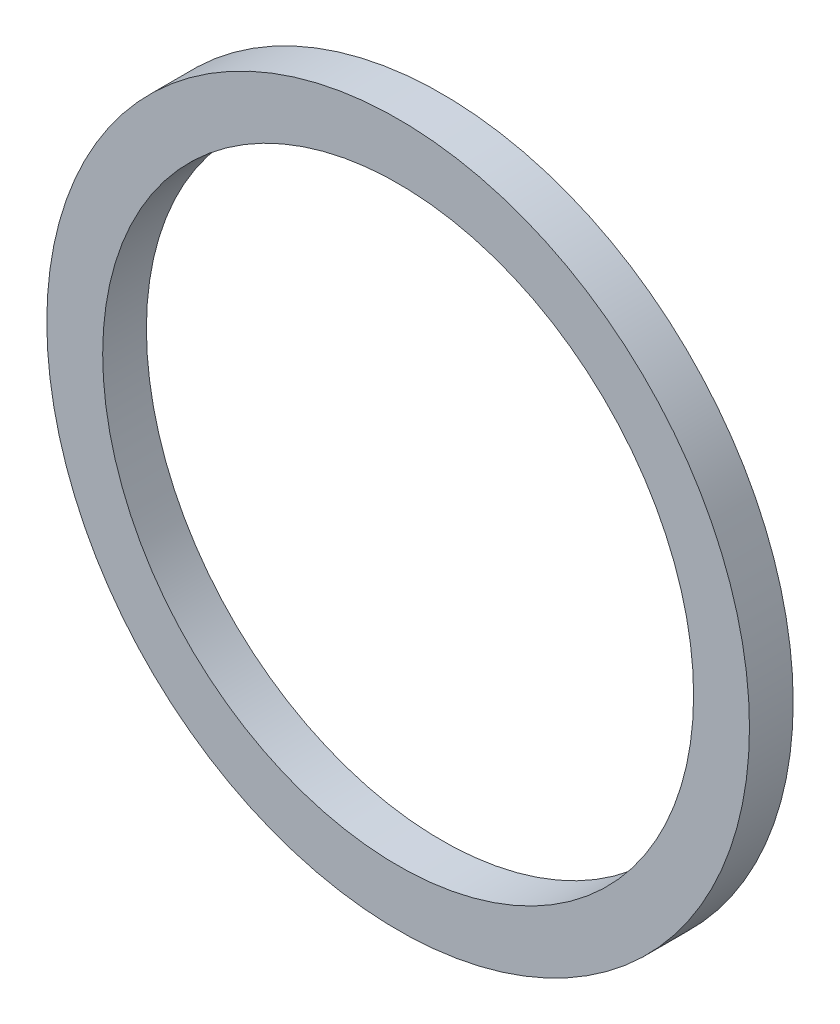
ISO-10303-21;
HEADER;
FILE_DESCRIPTION(('STEP AP214'),'2;1');
FILE_NAME('part.step','',(''),(''),'','','');
FILE_SCHEMA(('AUTOMOTIVE_DESIGN { 1 0 10303 214 1 1 1 1 }'));
ENDSEC;
DATA;
#1=APPLICATION_CONTEXT('core data for automotive mechanical design processes');
#2=APPLICATION_PROTOCOL_DEFINITION('international standard','automotive_design',2000,#1);
#3=PRODUCT_CONTEXT('',#1,'mechanical');
#4=PRODUCT('Part','Part','',(#3));
#5=PRODUCT_RELATED_PRODUCT_CATEGORY('part','',(#4));
#6=PRODUCT_DEFINITION_FORMATION('','',#4);
#7=PRODUCT_DEFINITION_CONTEXT('part definition',#1,'design');
#8=PRODUCT_DEFINITION('design','',#6,#7);
#9=PRODUCT_DEFINITION_SHAPE('','',#8);
#10=(LENGTH_UNIT() NAMED_UNIT(*) SI_UNIT(.MILLI.,.METRE.));
#11=(NAMED_UNIT(*) PLANE_ANGLE_UNIT() SI_UNIT($,.RADIAN.));
#12=(NAMED_UNIT(*) SI_UNIT($,.STERADIAN.) SOLID_ANGLE_UNIT());
#13=UNCERTAINTY_MEASURE_WITH_UNIT(LENGTH_MEASURE(1.E-05),#10,'distance_accuracy_value','');
#14=(GEOMETRIC_REPRESENTATION_CONTEXT(3) GLOBAL_UNCERTAINTY_ASSIGNED_CONTEXT((#13)) GLOBAL_UNIT_ASSIGNED_CONTEXT((#10,
#11,#12)) REPRESENTATION_CONTEXT('',''));
#15=CARTESIAN_POINT('',(0.,0.,0.));
#16=DIRECTION('',(0.,0.,1.));
#17=DIRECTION('',(1.,0.,0.));
#18=AXIS2_PLACEMENT_3D('',#15,#16,#17);
#19=CARTESIAN_POINT('',(0.,15.4807692307692,4.275));
#20=DIRECTION('',(0.,0.,-1.));
#21=DIRECTION('',(0.,-1.,0.));
#22=AXIS2_PLACEMENT_3D('',#19,#20,#21);
#23=PLANE('',#22);
#24=CARTESIAN_POINT('',(0.,0.,4.275));
#25=DIRECTION('',(0.,0.,1.));
#26=DIRECTION('',(1.,0.,0.));
#27=AXIS2_PLACEMENT_3D('',#24,#25,#26);
#28=CIRCLE('',#27,13.0192307692308);
#29=CARTESIAN_POINT('',(13.0192307692308,0.,4.275));
#30=VERTEX_POINT('',#29);
#31=EDGE_CURVE('E10',#30,#30,#28,.T.);
#32=ORIENTED_EDGE('',*,*,#31,.F.);
#33=EDGE_LOOP('',(#32));
#34=FACE_BOUND('',#33,.T.);
#35=CARTESIAN_POINT('',(0.,0.,4.275));
#36=DIRECTION('',(0.,0.,-1.));
#37=DIRECTION('',(1.,0.,0.));
#38=AXIS2_PLACEMENT_3D('',#35,#36,#37);
#39=CIRCLE('',#38,15.4807692307692);
#40=CARTESIAN_POINT('',(15.4807692307692,0.,4.275));
#41=VERTEX_POINT('',#40);
#42=EDGE_CURVE('E33',#41,#41,#39,.T.);
#43=ORIENTED_EDGE('',*,*,#42,.F.);
#44=EDGE_LOOP('',(#43));
#45=FACE_BOUND('',#44,.T.);
#46=ADVANCED_FACE('F15',(#34,#45),#23,.F.);
#47=CARTESIAN_POINT('',(0.,15.4807692307692,2.34835961884212));
#48=DIRECTION('',(0.,0.,1.));
#49=DIRECTION('',(1.,0.,0.));
#50=AXIS2_PLACEMENT_3D('',#47,#48,#49);
#51=PLANE('',#50);
#52=CARTESIAN_POINT('',(0.,0.,2.34835961884212));
#53=DIRECTION('',(0.,0.,1.));
#54=DIRECTION('',(1.,0.,0.));
#55=AXIS2_PLACEMENT_3D('',#52,#53,#54);
#56=CIRCLE('',#55,13.0192307692308);
#57=CARTESIAN_POINT('',(13.0192307692308,0.,2.34835961884212));
#58=VERTEX_POINT('',#57);
#59=EDGE_CURVE('E22',#58,#58,#56,.T.);
#60=ORIENTED_EDGE('',*,*,#59,.T.);
#61=EDGE_LOOP('',(#60));
#62=FACE_BOUND('',#61,.T.);
#63=CARTESIAN_POINT('',(0.,0.,2.34835961884212));
#64=DIRECTION('',(0.,0.,1.));
#65=DIRECTION('',(1.,0.,0.));
#66=AXIS2_PLACEMENT_3D('',#63,#64,#65);
#67=CIRCLE('',#66,15.4807692307692);
#68=CARTESIAN_POINT('',(15.4807692307692,0.,2.34835961884212));
#69=VERTEX_POINT('',#68);
#70=EDGE_CURVE('E39',#69,#69,#67,.T.);
#71=ORIENTED_EDGE('',*,*,#70,.F.);
#72=EDGE_LOOP('',(#71));
#73=FACE_BOUND('',#72,.T.);
#74=ADVANCED_FACE('F47',(#62,#73),#51,.F.);
#75=CARTESIAN_POINT('',(0.,0.,4.5));
#76=DIRECTION('',(0.,0.,1.));
#77=DIRECTION('',(1.,0.,0.));
#78=AXIS2_PLACEMENT_3D('',#75,#76,#77);
#79=CYLINDRICAL_SURFACE('',#78,13.0192307692308);
#80=ORIENTED_EDGE('',*,*,#31,.T.);
#81=EDGE_LOOP('',(#80));
#82=FACE_BOUND('',#81,.T.);
#83=ORIENTED_EDGE('',*,*,#59,.F.);
#84=EDGE_LOOP('',(#83));
#85=FACE_BOUND('',#84,.T.);
#86=ADVANCED_FACE('F51',(#82,#85),#79,.F.);
#87=CARTESIAN_POINT('',(0.,0.,4.5));
#88=DIRECTION('',(0.,0.,1.));
#89=DIRECTION('',(1.,0.,0.));
#90=AXIS2_PLACEMENT_3D('',#87,#88,#89);
#91=CYLINDRICAL_SURFACE('',#90,15.4807692307692);
#92=ORIENTED_EDGE('',*,*,#42,.T.);
#93=EDGE_LOOP('',(#92));
#94=FACE_BOUND('',#93,.T.);
#95=ORIENTED_EDGE('',*,*,#70,.T.);
#96=EDGE_LOOP('',(#95));
#97=FACE_BOUND('',#96,.T.);
#98=ADVANCED_FACE('F50',(#94,#97),#91,.T.);
#99=CLOSED_SHELL('',(#46,#74,#86,#98));
#100=MANIFOLD_SOLID_BREP('B1',#99);
#101=ADVANCED_BREP_SHAPE_REPRESENTATION('',(#18,#100),#14);
#102=SHAPE_DEFINITION_REPRESENTATION(#9,#101);
ENDSEC;
END-ISO-10303-21;
